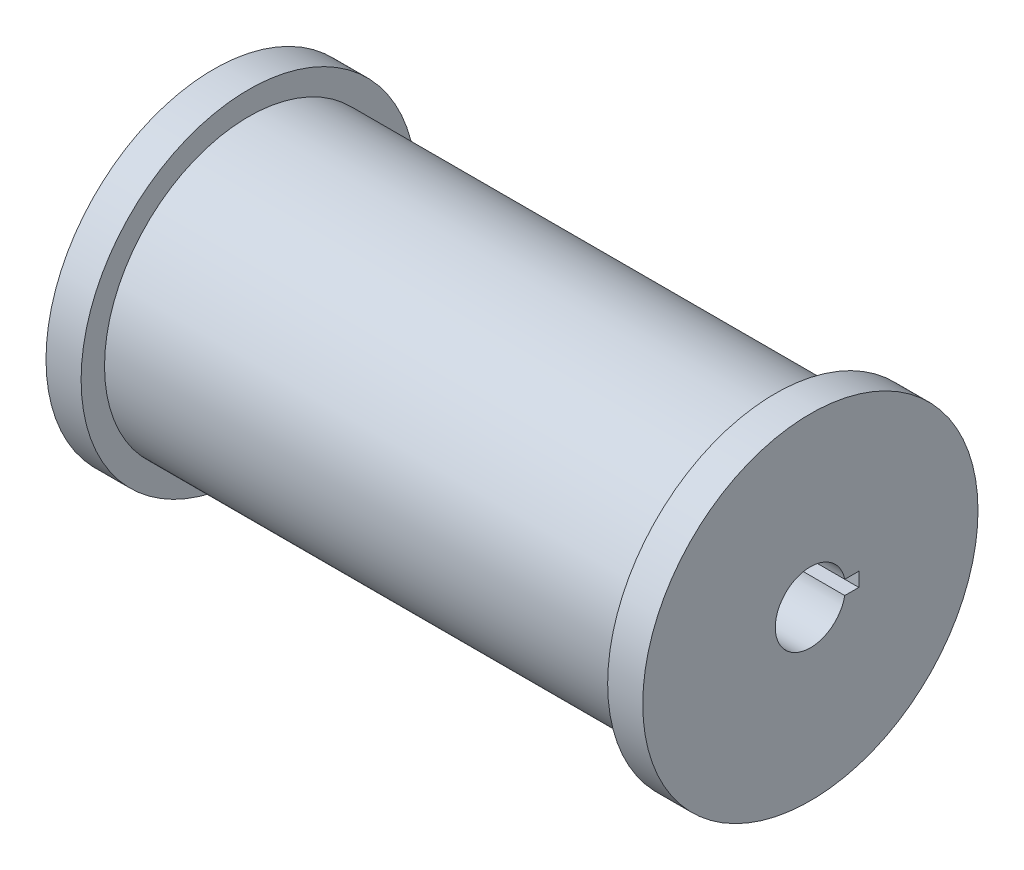
ISO-10303-21;
HEADER;
FILE_DESCRIPTION(('STEP AP214'),'2;1');
FILE_NAME('part.step','',(''),(''),'','','');
FILE_SCHEMA(('AUTOMOTIVE_DESIGN { 1 0 10303 214 1 1 1 1 }'));
ENDSEC;
DATA;
#1=APPLICATION_CONTEXT('core data for automotive mechanical design processes');
#2=APPLICATION_PROTOCOL_DEFINITION('international standard','automotive_design',2000,#1);
#3=PRODUCT_CONTEXT('',#1,'mechanical');
#4=PRODUCT('Part','Part','',(#3));
#5=PRODUCT_RELATED_PRODUCT_CATEGORY('part','',(#4));
#6=PRODUCT_DEFINITION_FORMATION('','',#4);
#7=PRODUCT_DEFINITION_CONTEXT('part definition',#1,'design');
#8=PRODUCT_DEFINITION('design','',#6,#7);
#9=PRODUCT_DEFINITION_SHAPE('','',#8);
#10=(LENGTH_UNIT() NAMED_UNIT(*) SI_UNIT(.MILLI.,.METRE.));
#11=(NAMED_UNIT(*) PLANE_ANGLE_UNIT() SI_UNIT($,.RADIAN.));
#12=(NAMED_UNIT(*) SI_UNIT($,.STERADIAN.) SOLID_ANGLE_UNIT());
#13=UNCERTAINTY_MEASURE_WITH_UNIT(LENGTH_MEASURE(1.E-05),#10,'distance_accuracy_value','');
#14=(GEOMETRIC_REPRESENTATION_CONTEXT(3) GLOBAL_UNCERTAINTY_ASSIGNED_CONTEXT((#13)) GLOBAL_UNIT_ASSIGNED_CONTEXT((#10,
#11,#12)) REPRESENTATION_CONTEXT('',''));
#15=CARTESIAN_POINT('',(0.,0.,0.));
#16=DIRECTION('',(0.,0.,1.));
#17=DIRECTION('',(1.,0.,0.));
#18=AXIS2_PLACEMENT_3D('',#15,#16,#17);
#19=CARTESIAN_POINT('',(-58.3273471285903,0.,0.));
#20=DIRECTION('',(-1.,0.,0.));
#21=DIRECTION('',(0.,0.,1.));
#22=AXIS2_PLACEMENT_3D('',#19,#20,#21);
#23=CYLINDRICAL_SURFACE('',#22,47.75);
#24=CARTESIAN_POINT('',(-85.,0.,0.));
#25=DIRECTION('',(-1.,0.,0.));
#26=DIRECTION('',(0.,0.,1.));
#27=AXIS2_PLACEMENT_3D('',#24,#25,#26);
#28=CIRCLE('',#27,47.75);
#29=CARTESIAN_POINT('',(-85.,0.,47.75));
#30=VERTEX_POINT('',#29);
#31=EDGE_CURVE('E104',#30,#30,#28,.T.);
#32=ORIENTED_EDGE('',*,*,#31,.F.);
#33=EDGE_LOOP('',(#32));
#34=FACE_BOUND('',#33,.T.);
#35=CARTESIAN_POINT('',(-75.,0.,0.));
#36=DIRECTION('',(-1.,0.,0.));
#37=DIRECTION('',(0.,0.,1.));
#38=AXIS2_PLACEMENT_3D('',#35,#36,#37);
#39=CIRCLE('',#38,47.75);
#40=CARTESIAN_POINT('',(-75.,0.,47.75));
#41=VERTEX_POINT('',#40);
#42=EDGE_CURVE('E11',#41,#41,#39,.T.);
#43=ORIENTED_EDGE('',*,*,#42,.T.);
#44=EDGE_LOOP('',(#43));
#45=FACE_BOUND('',#44,.T.);
#46=ADVANCED_FACE('F35',(#34,#45),#23,.T.);
#47=CARTESIAN_POINT('',(-75.,0.,-47.75));
#48=DIRECTION('',(-1.,0.,0.));
#49=DIRECTION('',(0.,0.,1.));
#50=AXIS2_PLACEMENT_3D('',#47,#48,#49);
#51=PLANE('',#50);
#52=ORIENTED_EDGE('',*,*,#42,.F.);
#53=EDGE_LOOP('',(#52));
#54=FACE_BOUND('',#53,.T.);
#55=CARTESIAN_POINT('',(-75.,0.,0.));
#56=DIRECTION('',(-1.,0.,0.));
#57=DIRECTION('',(0.,0.,1.));
#58=AXIS2_PLACEMENT_3D('',#55,#56,#57);
#59=CIRCLE('',#58,41.0789522285748);
#60=CARTESIAN_POINT('',(-75.,0.,41.0789522285748));
#61=VERTEX_POINT('',#60);
#62=EDGE_CURVE('E42',#61,#61,#59,.T.);
#63=ORIENTED_EDGE('',*,*,#62,.T.);
#64=EDGE_LOOP('',(#63));
#65=FACE_BOUND('',#64,.T.);
#66=ADVANCED_FACE('F123',(#54,#65),#51,.F.);
#67=CARTESIAN_POINT('',(-58.3273471285903,0.,0.));
#68=DIRECTION('',(-1.,0.,0.));
#69=DIRECTION('',(0.,0.,1.));
#70=AXIS2_PLACEMENT_3D('',#67,#68,#69);
#71=CYLINDRICAL_SURFACE('',#70,41.0789522285748);
#72=ORIENTED_EDGE('',*,*,#62,.F.);
#73=EDGE_LOOP('',(#72));
#74=FACE_BOUND('',#73,.T.);
#75=CARTESIAN_POINT('',(75.,0.,0.));
#76=DIRECTION('',(-1.,0.,0.));
#77=DIRECTION('',(0.,0.,1.));
#78=AXIS2_PLACEMENT_3D('',#75,#76,#77);
#79=CIRCLE('',#78,41.0789522285748);
#80=CARTESIAN_POINT('',(75.,0.,41.0789522285748));
#81=VERTEX_POINT('',#80);
#82=EDGE_CURVE('E118',#81,#81,#79,.T.);
#83=ORIENTED_EDGE('',*,*,#82,.T.);
#84=EDGE_LOOP('',(#83));
#85=FACE_BOUND('',#84,.T.);
#86=ADVANCED_FACE('F125',(#74,#85),#71,.T.);
#87=CARTESIAN_POINT('',(75.,0.,-47.75));
#88=DIRECTION('',(1.,0.,0.));
#89=DIRECTION('',(0.,0.,-1.));
#90=AXIS2_PLACEMENT_3D('',#87,#88,#89);
#91=PLANE('',#90);
#92=ORIENTED_EDGE('',*,*,#82,.F.);
#93=EDGE_LOOP('',(#92));
#94=FACE_BOUND('',#93,.T.);
#95=CARTESIAN_POINT('',(75.,0.,0.));
#96=DIRECTION('',(-1.,0.,0.));
#97=DIRECTION('',(0.,0.,1.));
#98=AXIS2_PLACEMENT_3D('',#95,#96,#97);
#99=CIRCLE('',#98,47.75);
#100=CARTESIAN_POINT('',(75.,0.,47.75));
#101=VERTEX_POINT('',#100);
#102=EDGE_CURVE('E115',#101,#101,#99,.T.);
#103=ORIENTED_EDGE('',*,*,#102,.T.);
#104=EDGE_LOOP('',(#103));
#105=FACE_BOUND('',#104,.T.);
#106=ADVANCED_FACE('F128',(#94,#105),#91,.F.);
#107=CARTESIAN_POINT('',(-58.3273471285903,0.,0.));
#108=DIRECTION('',(-1.,0.,0.));
#109=DIRECTION('',(0.,0.,1.));
#110=AXIS2_PLACEMENT_3D('',#107,#108,#109);
#111=CYLINDRICAL_SURFACE('',#110,47.75);
#112=ORIENTED_EDGE('',*,*,#102,.F.);
#113=EDGE_LOOP('',(#112));
#114=FACE_BOUND('',#113,.T.);
#115=CARTESIAN_POINT('',(85.,0.,0.));
#116=DIRECTION('',(-1.,0.,0.));
#117=DIRECTION('',(0.,0.,1.));
#118=AXIS2_PLACEMENT_3D('',#115,#116,#117);
#119=CIRCLE('',#118,47.75);
#120=CARTESIAN_POINT('',(85.,0.,47.75));
#121=VERTEX_POINT('',#120);
#122=EDGE_CURVE('E112',#121,#121,#119,.T.);
#123=ORIENTED_EDGE('',*,*,#122,.T.);
#124=EDGE_LOOP('',(#123));
#125=FACE_BOUND('',#124,.T.);
#126=ADVANCED_FACE('F134',(#114,#125),#111,.T.);
#127=CARTESIAN_POINT('',(85.,0.,-10.));
#128=DIRECTION('',(-1.,0.,0.));
#129=DIRECTION('',(0.,0.,1.));
#130=AXIS2_PLACEMENT_3D('',#127,#128,#129);
#131=PLANE('',#130);
#132=ORIENTED_EDGE('',*,*,#122,.F.);
#133=EDGE_LOOP('',(#132));
#134=FACE_BOUND('',#133,.T.);
#135=CARTESIAN_POINT('',(85.,0.,0.));
#136=DIRECTION('',(-1.,0.,0.));
#137=DIRECTION('',(0.,0.,1.));
#138=AXIS2_PLACEMENT_3D('',#135,#136,#137);
#139=CIRCLE('',#138,10.);
#140=CARTESIAN_POINT('',(85.,-2.,-9.79795897113272));
#141=VERTEX_POINT('',#140);
#142=CARTESIAN_POINT('',(85.,2.,-9.79795897113272));
#143=VERTEX_POINT('',#142);
#144=EDGE_CURVE('E98',#141,#143,#139,.T.);
#145=ORIENTED_EDGE('',*,*,#144,.T.);
#146=DIRECTION('',(0.,0.,1.));
#147=VECTOR('',#146,1.);
#148=CARTESIAN_POINT('',(85.,2.,-9.79795897113272));
#149=LINE('',#148,#147);
#150=CARTESIAN_POINT('',(85.,2.,-13.7979589711327));
#151=VERTEX_POINT('',#150);
#152=EDGE_CURVE('E75',#151,#143,#149,.T.);
#153=ORIENTED_EDGE('',*,*,#152,.F.);
#154=DIRECTION('',(0.,1.,0.));
#155=VECTOR('',#154,1.);
#156=CARTESIAN_POINT('',(85.,2.,-13.7979589711327));
#157=LINE('',#156,#155);
#158=CARTESIAN_POINT('',(85.,-2.,-13.7979589711327));
#159=VERTEX_POINT('',#158);
#160=EDGE_CURVE('E149',#159,#151,#157,.T.);
#161=ORIENTED_EDGE('',*,*,#160,.F.);
#162=DIRECTION('',(0.,0.,-1.));
#163=VECTOR('',#162,1.);
#164=CARTESIAN_POINT('',(85.,-2.,-9.79795897113272));
#165=LINE('',#164,#163);
#166=EDGE_CURVE('E148',#141,#159,#165,.T.);
#167=ORIENTED_EDGE('',*,*,#166,.F.);
#168=EDGE_LOOP('',(#145,#153,#161,#167));
#169=FACE_BOUND('',#168,.T.);
#170=ADVANCED_FACE('F140',(#134,#169),#131,.F.);
#171=CARTESIAN_POINT('',(-58.3273471285903,0.,0.));
#172=DIRECTION('',(-1.,0.,0.));
#173=DIRECTION('',(0.,0.,1.));
#174=AXIS2_PLACEMENT_3D('',#171,#172,#173);
#175=CYLINDRICAL_SURFACE('',#174,10.);
#176=CARTESIAN_POINT('',(70.,0.,0.));
#177=DIRECTION('',(-1.,0.,0.));
#178=DIRECTION('',(0.,0.,-1.));
#179=AXIS2_PLACEMENT_3D('',#176,#177,#178);
#180=CIRCLE('',#179,10.);
#181=CARTESIAN_POINT('',(70.,2.,-9.79795897113272));
#182=VERTEX_POINT('',#181);
#183=CARTESIAN_POINT('',(70.,-2.,-9.79795897113272));
#184=VERTEX_POINT('',#183);
#185=EDGE_CURVE('E88',#182,#184,#180,.T.);
#186=ORIENTED_EDGE('',*,*,#185,.F.);
#187=DIRECTION('',(1.,0.,0.));
#188=VECTOR('',#187,1.);
#189=CARTESIAN_POINT('',(70.,2.,-9.79795897113272));
#190=LINE('',#189,#188);
#191=EDGE_CURVE('E108',#182,#143,#190,.T.);
#192=ORIENTED_EDGE('',*,*,#191,.T.);
#193=ORIENTED_EDGE('',*,*,#144,.F.);
#194=DIRECTION('',(1.,0.,0.));
#195=VECTOR('',#194,1.);
#196=CARTESIAN_POINT('',(70.,-2.,-9.79795897113272));
#197=LINE('',#196,#195);
#198=EDGE_CURVE('E84',#184,#141,#197,.T.);
#199=ORIENTED_EDGE('',*,*,#198,.F.);
#200=EDGE_LOOP('',(#186,#192,#193,#199));
#201=FACE_BOUND('',#200,.T.);
#202=CARTESIAN_POINT('',(-85.,0.,0.));
#203=DIRECTION('',(-1.,0.,0.));
#204=DIRECTION('',(0.,0.,1.));
#205=AXIS2_PLACEMENT_3D('',#202,#203,#204);
#206=CIRCLE('',#205,9.99999999999999);
#207=CARTESIAN_POINT('',(-85.,0.,9.99999999999999));
#208=VERTEX_POINT('',#207);
#209=EDGE_CURVE('E107',#208,#208,#206,.T.);
#210=ORIENTED_EDGE('',*,*,#209,.T.);
#211=EDGE_LOOP('',(#210));
#212=FACE_BOUND('',#211,.T.);
#213=ADVANCED_FACE('F95',(#201,#212),#175,.F.);
#214=CARTESIAN_POINT('',(-85.,0.,-9.99999999999999));
#215=DIRECTION('',(1.,0.,0.));
#216=DIRECTION('',(0.,0.,-1.));
#217=AXIS2_PLACEMENT_3D('',#214,#215,#216);
#218=PLANE('',#217);
#219=ORIENTED_EDGE('',*,*,#209,.F.);
#220=EDGE_LOOP('',(#219));
#221=FACE_BOUND('',#220,.T.);
#222=ORIENTED_EDGE('',*,*,#31,.T.);
#223=EDGE_LOOP('',(#222));
#224=FACE_BOUND('',#223,.T.);
#225=ADVANCED_FACE('F164',(#221,#224),#218,.F.);
#226=CARTESIAN_POINT('',(70.,2.,-9.79795897113272));
#227=DIRECTION('',(0.,1.,0.));
#228=DIRECTION('',(0.,0.,1.));
#229=AXIS2_PLACEMENT_3D('',#226,#227,#228);
#230=PLANE('',#229);
#231=ORIENTED_EDGE('',*,*,#152,.T.);
#232=ORIENTED_EDGE('',*,*,#191,.F.);
#233=DIRECTION('',(0.,0.,1.));
#234=VECTOR('',#233,1.);
#235=CARTESIAN_POINT('',(70.,2.,-9.79795897113272));
#236=LINE('',#235,#234);
#237=CARTESIAN_POINT('',(70.,2.,-13.7979589711327));
#238=VERTEX_POINT('',#237);
#239=EDGE_CURVE('E49',#238,#182,#236,.T.);
#240=ORIENTED_EDGE('',*,*,#239,.F.);
#241=DIRECTION('',(1.,0.,0.));
#242=VECTOR('',#241,1.);
#243=CARTESIAN_POINT('',(70.,2.,-13.7979589711327));
#244=LINE('',#243,#242);
#245=EDGE_CURVE('E58',#238,#151,#244,.T.);
#246=ORIENTED_EDGE('',*,*,#245,.T.);
#247=EDGE_LOOP('',(#231,#232,#240,#246));
#248=FACE_BOUND('',#247,.T.);
#249=ADVANCED_FACE('F155',(#248),#230,.F.);
#250=CARTESIAN_POINT('',(70.,2.,-13.7979589711327));
#251=DIRECTION('',(0.,0.,-1.));
#252=DIRECTION('',(0.,1.,0.));
#253=AXIS2_PLACEMENT_3D('',#250,#251,#252);
#254=PLANE('',#253);
#255=ORIENTED_EDGE('',*,*,#160,.T.);
#256=ORIENTED_EDGE('',*,*,#245,.F.);
#257=DIRECTION('',(0.,1.,0.));
#258=VECTOR('',#257,1.);
#259=CARTESIAN_POINT('',(70.,2.,-13.7979589711327));
#260=LINE('',#259,#258);
#261=CARTESIAN_POINT('',(70.,-2.,-13.7979589711327));
#262=VERTEX_POINT('',#261);
#263=EDGE_CURVE('E87',#262,#238,#260,.T.);
#264=ORIENTED_EDGE('',*,*,#263,.F.);
#265=DIRECTION('',(1.,0.,0.));
#266=VECTOR('',#265,1.);
#267=CARTESIAN_POINT('',(70.,-2.,-13.7979589711327));
#268=LINE('',#267,#266);
#269=EDGE_CURVE('E86',#262,#159,#268,.T.);
#270=ORIENTED_EDGE('',*,*,#269,.T.);
#271=EDGE_LOOP('',(#255,#256,#264,#270));
#272=FACE_BOUND('',#271,.T.);
#273=ADVANCED_FACE('F156',(#272),#254,.F.);
#274=CARTESIAN_POINT('',(70.,-2.,-9.79795897113272));
#275=DIRECTION('',(0.,-1.,0.));
#276=DIRECTION('',(0.,0.,-1.));
#277=AXIS2_PLACEMENT_3D('',#274,#275,#276);
#278=PLANE('',#277);
#279=ORIENTED_EDGE('',*,*,#166,.T.);
#280=ORIENTED_EDGE('',*,*,#269,.F.);
#281=DIRECTION('',(0.,0.,-1.));
#282=VECTOR('',#281,1.);
#283=CARTESIAN_POINT('',(70.,-2.,-9.79795897113272));
#284=LINE('',#283,#282);
#285=EDGE_CURVE('E80',#184,#262,#284,.T.);
#286=ORIENTED_EDGE('',*,*,#285,.F.);
#287=ORIENTED_EDGE('',*,*,#198,.T.);
#288=EDGE_LOOP('',(#279,#280,#286,#287));
#289=FACE_BOUND('',#288,.T.);
#290=ADVANCED_FACE('F82',(#289),#278,.F.);
#291=CARTESIAN_POINT('',(70.,0.,0.));
#292=DIRECTION('',(1.,0.,0.));
#293=DIRECTION('',(0.,0.,-1.));
#294=AXIS2_PLACEMENT_3D('',#291,#292,#293);
#295=PLANE('',#294);
#296=ORIENTED_EDGE('',*,*,#185,.T.);
#297=ORIENTED_EDGE('',*,*,#285,.T.);
#298=ORIENTED_EDGE('',*,*,#263,.T.);
#299=ORIENTED_EDGE('',*,*,#239,.T.);
#300=EDGE_LOOP('',(#296,#297,#298,#299));
#301=FACE_BOUND('',#300,.T.);
#302=ADVANCED_FACE('F91',(#301),#295,.T.);
#303=CLOSED_SHELL('',(#46,#66,#86,#106,#126,#170,#213,#225,#249,#273,#290,#302));
#304=MANIFOLD_SOLID_BREP('B2',#303);
#305=ADVANCED_BREP_SHAPE_REPRESENTATION('',(#18,#304),#14);
#306=SHAPE_DEFINITION_REPRESENTATION(#9,#305);
ENDSEC;
END-ISO-10303-21;
